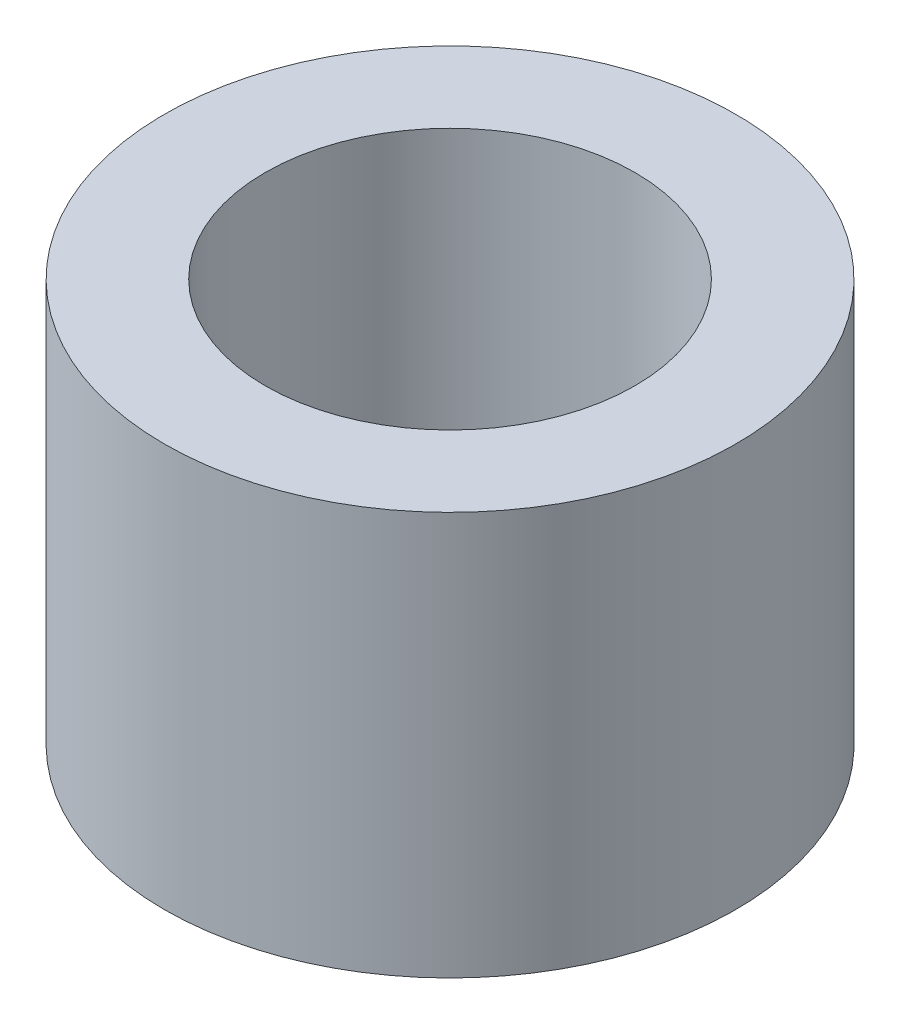
ISO-10303-21;
HEADER;
FILE_DESCRIPTION(('STEP AP214'),'2;1');
FILE_NAME('part.step','',(''),(''),'','','');
FILE_SCHEMA(('AUTOMOTIVE_DESIGN { 1 0 10303 214 1 1 1 1 }'));
ENDSEC;
DATA;
#1=APPLICATION_CONTEXT('core data for automotive mechanical design processes');
#2=APPLICATION_PROTOCOL_DEFINITION('international standard','automotive_design',2000,#1);
#3=PRODUCT_CONTEXT('',#1,'mechanical');
#4=PRODUCT('Part','Part','',(#3));
#5=PRODUCT_RELATED_PRODUCT_CATEGORY('part','',(#4));
#6=PRODUCT_DEFINITION_FORMATION('','',#4);
#7=PRODUCT_DEFINITION_CONTEXT('part definition',#1,'design');
#8=PRODUCT_DEFINITION('design','',#6,#7);
#9=PRODUCT_DEFINITION_SHAPE('','',#8);
#10=(LENGTH_UNIT() NAMED_UNIT(*) SI_UNIT(.MILLI.,.METRE.));
#11=(NAMED_UNIT(*) PLANE_ANGLE_UNIT() SI_UNIT($,.RADIAN.));
#12=(NAMED_UNIT(*) SI_UNIT($,.STERADIAN.) SOLID_ANGLE_UNIT());
#13=UNCERTAINTY_MEASURE_WITH_UNIT(LENGTH_MEASURE(1.E-05),#10,'distance_accuracy_value','');
#14=(GEOMETRIC_REPRESENTATION_CONTEXT(3) GLOBAL_UNCERTAINTY_ASSIGNED_CONTEXT((#13)) GLOBAL_UNIT_ASSIGNED_CONTEXT((#10,
#11,#12)) REPRESENTATION_CONTEXT('',''));
#15=CARTESIAN_POINT('',(0.,0.,0.));
#16=DIRECTION('',(0.,0.,1.));
#17=DIRECTION('',(1.,0.,0.));
#18=AXIS2_PLACEMENT_3D('',#15,#16,#17);
#19=CARTESIAN_POINT('',(0.,6.,0.));
#20=DIRECTION('',(0.,1.,0.));
#21=DIRECTION('',(0.,0.,1.));
#22=AXIS2_PLACEMENT_3D('',#19,#20,#21);
#23=PLANE('',#22);
#24=CARTESIAN_POINT('',(0.,6.,0.));
#25=DIRECTION('',(0.,1.,0.));
#26=DIRECTION('',(0.,0.,1.));
#27=AXIS2_PLACEMENT_3D('',#24,#25,#26);
#28=CIRCLE('',#27,4.25);
#29=CARTESIAN_POINT('',(0.,6.,4.25));
#30=VERTEX_POINT('',#29);
#31=EDGE_CURVE('E10',#30,#30,#28,.T.);
#32=ORIENTED_EDGE('',*,*,#31,.T.);
#33=EDGE_LOOP('',(#32));
#34=FACE_BOUND('',#33,.T.);
#35=CARTESIAN_POINT('',(0.,6.,0.));
#36=DIRECTION('',(0.,1.,0.));
#37=DIRECTION('',(0.,0.,1.));
#38=AXIS2_PLACEMENT_3D('',#35,#36,#37);
#39=CIRCLE('',#38,2.75);
#40=CARTESIAN_POINT('',(0.,6.,2.75));
#41=VERTEX_POINT('',#40);
#42=EDGE_CURVE('E54',#41,#41,#39,.T.);
#43=ORIENTED_EDGE('',*,*,#42,.F.);
#44=EDGE_LOOP('',(#43));
#45=FACE_BOUND('',#44,.T.);
#46=ADVANCED_FACE('F41',(#34,#45),#23,.T.);
#47=CARTESIAN_POINT('',(0.,0.,0.));
#48=DIRECTION('',(0.,1.,0.));
#49=DIRECTION('',(0.,0.,1.));
#50=AXIS2_PLACEMENT_3D('',#47,#48,#49);
#51=PLANE('',#50);
#52=CARTESIAN_POINT('',(0.,0.,0.));
#53=DIRECTION('',(0.,1.,0.));
#54=DIRECTION('',(0.,0.,1.));
#55=AXIS2_PLACEMENT_3D('',#52,#53,#54);
#56=CIRCLE('',#55,4.25);
#57=CARTESIAN_POINT('',(0.,0.,4.25));
#58=VERTEX_POINT('',#57);
#59=EDGE_CURVE('E44',#58,#58,#56,.T.);
#60=ORIENTED_EDGE('',*,*,#59,.F.);
#61=EDGE_LOOP('',(#60));
#62=FACE_BOUND('',#61,.T.);
#63=CARTESIAN_POINT('',(0.,0.,0.));
#64=DIRECTION('',(0.,1.,0.));
#65=DIRECTION('',(0.,0.,1.));
#66=AXIS2_PLACEMENT_3D('',#63,#64,#65);
#67=CIRCLE('',#66,2.75);
#68=CARTESIAN_POINT('',(0.,0.,2.75));
#69=VERTEX_POINT('',#68);
#70=EDGE_CURVE('E60',#69,#69,#67,.T.);
#71=ORIENTED_EDGE('',*,*,#70,.T.);
#72=EDGE_LOOP('',(#71));
#73=FACE_BOUND('',#72,.T.);
#74=ADVANCED_FACE('F70',(#62,#73),#51,.F.);
#75=CARTESIAN_POINT('',(0.,6.,0.));
#76=DIRECTION('',(0.,-1.,0.));
#77=DIRECTION('',(0.,0.,-1.));
#78=AXIS2_PLACEMENT_3D('',#75,#76,#77);
#79=CYLINDRICAL_SURFACE('',#78,4.25);
#80=ORIENTED_EDGE('',*,*,#31,.F.);
#81=EDGE_LOOP('',(#80));
#82=FACE_BOUND('',#81,.T.);
#83=ORIENTED_EDGE('',*,*,#59,.T.);
#84=EDGE_LOOP('',(#83));
#85=FACE_BOUND('',#84,.T.);
#86=ADVANCED_FACE('F43',(#82,#85),#79,.T.);
#87=CARTESIAN_POINT('',(0.,6.,0.));
#88=DIRECTION('',(0.,-1.,0.));
#89=DIRECTION('',(0.,0.,-1.));
#90=AXIS2_PLACEMENT_3D('',#87,#88,#89);
#91=CYLINDRICAL_SURFACE('',#90,2.75);
#92=ORIENTED_EDGE('',*,*,#42,.T.);
#93=EDGE_LOOP('',(#92));
#94=FACE_BOUND('',#93,.T.);
#95=ORIENTED_EDGE('',*,*,#70,.F.);
#96=EDGE_LOOP('',(#95));
#97=FACE_BOUND('',#96,.T.);
#98=ADVANCED_FACE('F61',(#94,#97),#91,.F.);
#99=CLOSED_SHELL('',(#46,#74,#86,#98));
#100=MANIFOLD_SOLID_BREP('B2',#99);
#101=ADVANCED_BREP_SHAPE_REPRESENTATION('',(#18,#100),#14);
#102=SHAPE_DEFINITION_REPRESENTATION(#9,#101);
ENDSEC;
END-ISO-10303-21;
